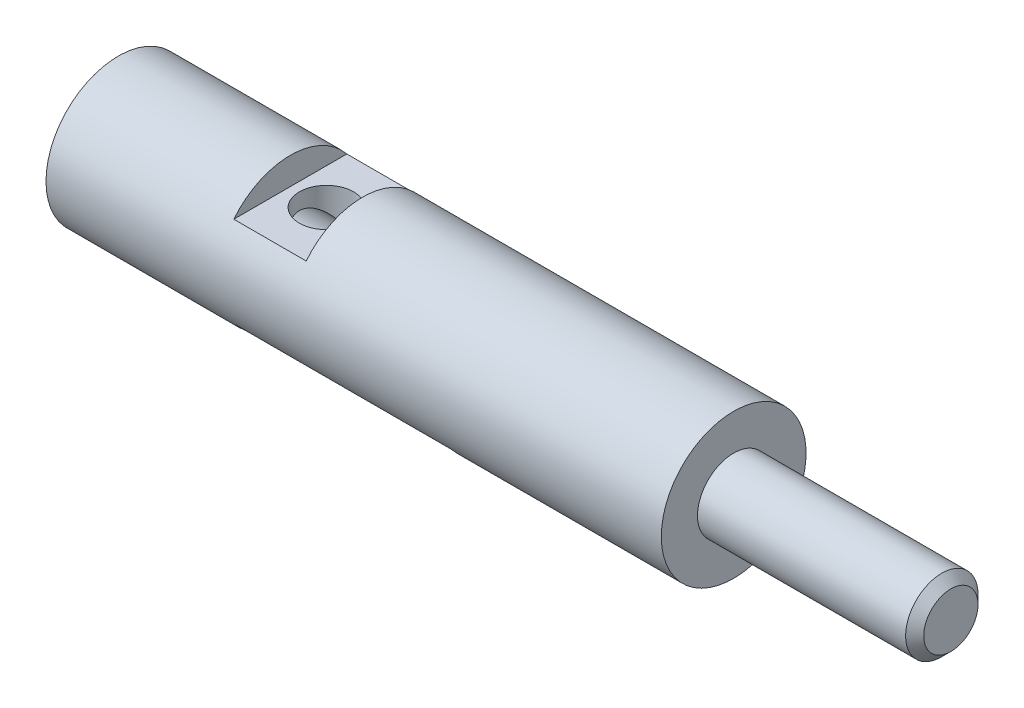
ISO-10303-21;
HEADER;
FILE_DESCRIPTION(('STEP AP214'),'2;1');
FILE_NAME('part.step','',(''),(''),'','','');
FILE_SCHEMA(('AUTOMOTIVE_DESIGN { 1 0 10303 214 1 1 1 1 }'));
ENDSEC;
DATA;
#1=APPLICATION_CONTEXT('core data for automotive mechanical design processes');
#2=APPLICATION_PROTOCOL_DEFINITION('international standard','automotive_design',2000,#1);
#3=PRODUCT_CONTEXT('',#1,'mechanical');
#4=PRODUCT('Part','Part','',(#3));
#5=PRODUCT_RELATED_PRODUCT_CATEGORY('part','',(#4));
#6=PRODUCT_DEFINITION_FORMATION('','',#4);
#7=PRODUCT_DEFINITION_CONTEXT('part definition',#1,'design');
#8=PRODUCT_DEFINITION('design','',#6,#7);
#9=PRODUCT_DEFINITION_SHAPE('','',#8);
#10=(LENGTH_UNIT() NAMED_UNIT(*) SI_UNIT(.MILLI.,.METRE.));
#11=(NAMED_UNIT(*) PLANE_ANGLE_UNIT() SI_UNIT($,.RADIAN.));
#12=(NAMED_UNIT(*) SI_UNIT($,.STERADIAN.) SOLID_ANGLE_UNIT());
#13=UNCERTAINTY_MEASURE_WITH_UNIT(LENGTH_MEASURE(1.E-05),#10,'distance_accuracy_value','');
#14=(GEOMETRIC_REPRESENTATION_CONTEXT(3) GLOBAL_UNCERTAINTY_ASSIGNED_CONTEXT((#13)) GLOBAL_UNIT_ASSIGNED_CONTEXT((#10,
#11,#12)) REPRESENTATION_CONTEXT('',''));
#15=CARTESIAN_POINT('',(0.,0.,0.));
#16=DIRECTION('',(0.,0.,1.));
#17=DIRECTION('',(1.,0.,0.));
#18=AXIS2_PLACEMENT_3D('',#15,#16,#17);
#19=CARTESIAN_POINT('',(-15.6774193548387,0.,0.));
#20=DIRECTION('',(-1.,0.,0.));
#21=DIRECTION('',(0.,0.,1.));
#22=AXIS2_PLACEMENT_3D('',#19,#20,#21);
#23=PLANE('',#22);
#24=CARTESIAN_POINT('',(-15.6774193548387,0.,0.));
#25=DIRECTION('',(-1.,0.,0.));
#26=DIRECTION('',(0.,0.,1.));
#27=AXIS2_PLACEMENT_3D('',#24,#25,#26);
#28=CIRCLE('',#27,1.59999999999999);
#29=CARTESIAN_POINT('',(-15.6774193548387,0.,1.59999999999999));
#30=VERTEX_POINT('',#29);
#31=EDGE_CURVE('E115',#30,#30,#28,.T.);
#32=ORIENTED_EDGE('',*,*,#31,.F.);
#33=EDGE_LOOP('',(#32));
#34=FACE_BOUND('',#33,.T.);
#35=CARTESIAN_POINT('',(-15.6774193548387,0.,0.));
#36=DIRECTION('',(-1.,0.,0.));
#37=DIRECTION('',(0.,0.,1.));
#38=AXIS2_PLACEMENT_3D('',#35,#36,#37);
#39=CIRCLE('',#38,4.);
#40=CARTESIAN_POINT('',(-15.6774193548387,0.,4.));
#41=VERTEX_POINT('',#40);
#42=EDGE_CURVE('E131',#41,#41,#39,.T.);
#43=ORIENTED_EDGE('',*,*,#42,.T.);
#44=EDGE_LOOP('',(#43));
#45=FACE_BOUND('',#44,.T.);
#46=ADVANCED_FACE('F40',(#34,#45),#23,.T.);
#47=CARTESIAN_POINT('',(-21.4193548387097,0.,0.));
#48=DIRECTION('',(-1.,0.,0.));
#49=DIRECTION('',(0.,0.,1.));
#50=AXIS2_PLACEMENT_3D('',#47,#48,#49);
#51=CYLINDRICAL_SURFACE('',#50,4.);
#52=CARTESIAN_POINT('',(5.8225806451613,0.,0.));
#53=DIRECTION('',(1.,0.,0.));
#54=DIRECTION('',(0.,0.,-1.));
#55=AXIS2_PLACEMENT_3D('',#52,#53,#54);
#56=CIRCLE('',#55,4.);
#57=CARTESIAN_POINT('',(5.8225806451613,-2.5,-3.1224989991992));
#58=VERTEX_POINT('',#57);
#59=CARTESIAN_POINT('',(5.8225806451613,-2.5,3.1224989991992));
#60=VERTEX_POINT('',#59);
#61=EDGE_CURVE('E99',#58,#60,#56,.F.);
#62=ORIENTED_EDGE('',*,*,#61,.F.);
#63=DIRECTION('',(-1.,0.,0.));
#64=VECTOR('',#63,1.);
#65=CARTESIAN_POINT('',(-21.4193548387097,-2.5,-3.1224989991992));
#66=LINE('',#65,#64);
#67=CARTESIAN_POINT('',(-6.1774193548387,-2.5,-3.1224989991992));
#68=VERTEX_POINT('',#67);
#69=EDGE_CURVE('E11',#68,#58,#66,.F.);
#70=ORIENTED_EDGE('',*,*,#69,.F.);
#71=CARTESIAN_POINT('',(-6.1774193548387,0.,0.));
#72=DIRECTION('',(-1.,0.,0.));
#73=DIRECTION('',(0.,0.,1.));
#74=AXIS2_PLACEMENT_3D('',#71,#72,#73);
#75=CIRCLE('',#74,4.);
#76=CARTESIAN_POINT('',(-6.1774193548387,-2.5,3.1224989991992));
#77=VERTEX_POINT('',#76);
#78=EDGE_CURVE('E50',#77,#68,#75,.F.);
#79=ORIENTED_EDGE('',*,*,#78,.F.);
#80=DIRECTION('',(-1.,0.,0.));
#81=VECTOR('',#80,1.);
#82=CARTESIAN_POINT('',(-21.4193548387097,-2.5,3.1224989991992));
#83=LINE('',#82,#81);
#84=EDGE_CURVE('E149',#60,#77,#83,.T.);
#85=ORIENTED_EDGE('',*,*,#84,.F.);
#86=EDGE_LOOP('',(#62,#70,#79,#85));
#87=FACE_BOUND('',#86,.T.);
#88=CARTESIAN_POINT('',(-2.1774193548387,0.,0.));
#89=DIRECTION('',(1.,0.,0.));
#90=DIRECTION('',(0.,1.,0.));
#91=AXIS2_PLACEMENT_3D('',#88,#89,#90);
#92=CIRCLE('',#91,4.);
#93=CARTESIAN_POINT('',(-2.1774193548387,2.5,3.1224989991992));
#94=VERTEX_POINT('',#93);
#95=CARTESIAN_POINT('',(-2.1774193548387,2.5,-3.1224989991992));
#96=VERTEX_POINT('',#95);
#97=EDGE_CURVE('E85',#94,#96,#92,.F.);
#98=ORIENTED_EDGE('',*,*,#97,.F.);
#99=DIRECTION('',(-1.,0.,0.));
#100=VECTOR('',#99,1.);
#101=CARTESIAN_POINT('',(-21.4193548387097,2.5,3.1224989991992));
#102=LINE('',#101,#100);
#103=CARTESIAN_POINT('',(-6.1774193548387,2.5,3.1224989991992));
#104=VERTEX_POINT('',#103);
#105=EDGE_CURVE('E88',#104,#94,#102,.F.);
#106=ORIENTED_EDGE('',*,*,#105,.F.);
#107=CARTESIAN_POINT('',(-6.17741935483869,0.,0.));
#108=DIRECTION('',(-1.,0.,0.));
#109=DIRECTION('',(0.,-1.,0.));
#110=AXIS2_PLACEMENT_3D('',#107,#108,#109);
#111=CIRCLE('',#110,4.);
#112=CARTESIAN_POINT('',(-6.1774193548387,2.5,-3.1224989991992));
#113=VERTEX_POINT('',#112);
#114=EDGE_CURVE('E92',#113,#104,#111,.F.);
#115=ORIENTED_EDGE('',*,*,#114,.F.);
#116=DIRECTION('',(-1.,0.,0.));
#117=VECTOR('',#116,1.);
#118=CARTESIAN_POINT('',(-21.4193548387097,2.5,-3.1224989991992));
#119=LINE('',#118,#117);
#120=EDGE_CURVE('E89',#96,#113,#119,.T.);
#121=ORIENTED_EDGE('',*,*,#120,.F.);
#122=EDGE_LOOP('',(#98,#106,#115,#121));
#123=FACE_BOUND('',#122,.T.);
#124=CARTESIAN_POINT('',(18.3225806451613,0.,0.));
#125=DIRECTION('',(-1.,0.,0.));
#126=DIRECTION('',(0.,0.,1.));
#127=AXIS2_PLACEMENT_3D('',#124,#125,#126);
#128=CIRCLE('',#127,4.);
#129=CARTESIAN_POINT('',(18.3225806451613,0.,4.));
#130=VERTEX_POINT('',#129);
#131=EDGE_CURVE('E127',#130,#130,#128,.T.);
#132=ORIENTED_EDGE('',*,*,#131,.T.);
#133=EDGE_LOOP('',(#132));
#134=FACE_BOUND('',#133,.T.);
#135=ORIENTED_EDGE('',*,*,#42,.F.);
#136=EDGE_LOOP('',(#135));
#137=FACE_BOUND('',#136,.T.);
#138=ADVANCED_FACE('F86',(#87,#123,#134,#137),#51,.T.);
#139=CARTESIAN_POINT('',(18.3225806451613,-4.,0.));
#140=DIRECTION('',(1.,0.,0.));
#141=DIRECTION('',(0.,0.,-1.));
#142=AXIS2_PLACEMENT_3D('',#139,#140,#141);
#143=PLANE('',#142);
#144=CARTESIAN_POINT('',(18.3225806451613,0.,0.));
#145=DIRECTION('',(-1.,0.,0.));
#146=DIRECTION('',(0.,0.,1.));
#147=AXIS2_PLACEMENT_3D('',#144,#145,#146);
#148=CIRCLE('',#147,2.);
#149=CARTESIAN_POINT('',(18.3225806451613,0.,2.));
#150=VERTEX_POINT('',#149);
#151=EDGE_CURVE('E123',#150,#150,#148,.T.);
#152=ORIENTED_EDGE('',*,*,#151,.T.);
#153=EDGE_LOOP('',(#152));
#154=FACE_BOUND('',#153,.T.);
#155=ORIENTED_EDGE('',*,*,#131,.F.);
#156=EDGE_LOOP('',(#155));
#157=FACE_BOUND('',#156,.T.);
#158=ADVANCED_FACE('F183',(#154,#157),#143,.T.);
#159=CARTESIAN_POINT('',(-21.4193548387097,0.,0.));
#160=DIRECTION('',(-1.,0.,0.));
#161=DIRECTION('',(0.,0.,1.));
#162=AXIS2_PLACEMENT_3D('',#159,#160,#161);
#163=CYLINDRICAL_SURFACE('',#162,2.);
#164=CARTESIAN_POINT('',(29.8225806451613,0.,0.));
#165=DIRECTION('',(1.,0.,0.));
#166=DIRECTION('',(0.,0.,-1.));
#167=AXIS2_PLACEMENT_3D('',#164,#165,#166);
#168=CIRCLE('',#167,2.);
#169=CARTESIAN_POINT('',(29.8225806451613,0.,-2.));
#170=VERTEX_POINT('',#169);
#171=EDGE_CURVE('E135',#170,#170,#168,.F.);
#172=ORIENTED_EDGE('',*,*,#171,.T.);
#173=EDGE_LOOP('',(#172));
#174=FACE_BOUND('',#173,.T.);
#175=ORIENTED_EDGE('',*,*,#151,.F.);
#176=EDGE_LOOP('',(#175));
#177=FACE_BOUND('',#176,.T.);
#178=ADVANCED_FACE('F190',(#174,#177),#163,.T.);
#179=CARTESIAN_POINT('',(30.3225806451613,-2.,0.));
#180=DIRECTION('',(1.,0.,0.));
#181=DIRECTION('',(0.,0.,-1.));
#182=AXIS2_PLACEMENT_3D('',#179,#180,#181);
#183=PLANE('',#182);
#184=CARTESIAN_POINT('',(30.3225806451613,0.,0.));
#185=DIRECTION('',(1.,0.,0.));
#186=DIRECTION('',(0.,0.,-1.));
#187=AXIS2_PLACEMENT_3D('',#184,#185,#186);
#188=CIRCLE('',#187,1.5);
#189=CARTESIAN_POINT('',(30.3225806451613,0.,-1.5));
#190=VERTEX_POINT('',#189);
#191=EDGE_CURVE('E139',#190,#190,#188,.T.);
#192=ORIENTED_EDGE('',*,*,#191,.T.);
#193=EDGE_LOOP('',(#192));
#194=FACE_BOUND('',#193,.T.);
#195=ADVANCED_FACE('F194',(#194),#183,.T.);
#196=CARTESIAN_POINT('',(29.8225806451613,0.,0.));
#197=DIRECTION('',(-1.,0.,0.));
#198=DIRECTION('',(0.,0.,1.));
#199=AXIS2_PLACEMENT_3D('',#196,#197,#198);
#200=CONICAL_SURFACE('',#199,2.,0.78539816339744);
#201=ORIENTED_EDGE('',*,*,#191,.F.);
#202=EDGE_LOOP('',(#201));
#203=FACE_BOUND('',#202,.T.);
#204=ORIENTED_EDGE('',*,*,#171,.F.);
#205=EDGE_LOOP('',(#204));
#206=FACE_BOUND('',#205,.T.);
#207=ADVANCED_FACE('F43',(#203,#206),#200,.T.);
#208=CARTESIAN_POINT('',(-1.6774193548387,0.,0.));
#209=DIRECTION('',(-1.,0.,0.));
#210=DIRECTION('',(0.,0.,1.));
#211=AXIS2_PLACEMENT_3D('',#208,#209,#210);
#212=CONICAL_SURFACE('',#211,1.6,1.02974425867665);
#213=CARTESIAN_POINT('',(-0.7160423643946,0.,0.));
#214=VERTEX_POINT('',#213);
#215=VERTEX_LOOP('',#214);
#216=FACE_BOUND('',#215,.T.);
#217=CARTESIAN_POINT('',(-1.6774193548387,0.,0.));
#218=DIRECTION('',(-1.,0.,0.));
#219=DIRECTION('',(0.,0.,1.));
#220=AXIS2_PLACEMENT_3D('',#217,#218,#219);
#221=CIRCLE('',#220,1.6);
#222=CARTESIAN_POINT('',(-1.6774193548387,0.,1.6));
#223=VERTEX_POINT('',#222);
#224=EDGE_CURVE('E119',#223,#223,#221,.T.);
#225=ORIENTED_EDGE('',*,*,#224,.T.);
#226=EDGE_LOOP('',(#225));
#227=FACE_BOUND('',#226,.T.);
#228=ADVANCED_FACE('F199',(#216,#227),#212,.F.);
#229=CARTESIAN_POINT('',(-15.6774193548387,0.,0.));
#230=DIRECTION('',(-1.,0.,0.));
#231=DIRECTION('',(0.,0.,1.));
#232=AXIS2_PLACEMENT_3D('',#229,#230,#231);
#233=CYLINDRICAL_SURFACE('',#232,1.59999999999999);
#234=CARTESIAN_POINT('',(-4.1774193548387,0.556776436282982,1.5));
#235=CARTESIAN_POINT('',(-4.13823363624218,0.556794360307957,1.49999591748038));
#236=CARTESIAN_POINT('',(-4.09898417362593,0.561044818005696,1.49843522559346));
#237=CARTESIAN_POINT('',(-4.02213426123864,0.576770998609167,1.49244676287404));
#238=CARTESIAN_POINT('',(-3.98454425011322,0.588286957962538,1.48800302176562));
#239=CARTESIAN_POINT('',(-3.89141145581981,0.623719616327495,1.47360085341389));
#240=CARTESIAN_POINT('',(-3.8374669379379,0.65097178401395,1.46195096807718));
#241=CARTESIAN_POINT('',(-3.73382850897223,0.710622919731765,1.43391850703446));
#242=CARTESIAN_POINT('',(-3.68415281490706,0.74304240844939,1.4175168390555));
#243=CARTESIAN_POINT('',(-3.58859824607405,0.809669158095594,1.38053371899763));
#244=CARTESIAN_POINT('',(-3.54268165158658,0.843850970278846,1.36000358385786));
#245=CARTESIAN_POINT('',(-3.45348473622686,0.912847778038623,1.31469444042559));
#246=CARTESIAN_POINT('',(-3.41020653251755,0.947663253747795,1.28991207923037));
#247=CARTESIAN_POINT('',(-3.28417818317098,1.05146267100392,1.20916432834585));
#248=CARTESIAN_POINT('',(-3.20499154202155,1.11998237999353,1.146703710984));
#249=CARTESIAN_POINT('',(-3.07756217907269,1.23251534447499,1.0227192324906));
#250=CARTESIAN_POINT('',(-3.02669545492086,1.27819470502894,0.965377618728459));
#251=CARTESIAN_POINT('',(-2.93268703822664,1.36343557192659,0.840664900623478));
#252=CARTESIAN_POINT('',(-2.88953201919341,1.40300761577932,0.77331147397631));
#253=CARTESIAN_POINT('',(-2.82113967641256,1.46607021232606,0.64396348077451));
#254=CARTESIAN_POINT('',(-2.7940425246034,1.49119386471929,0.583755998073617));
#255=CARTESIAN_POINT('',(-2.74750260562651,1.53446652026933,0.458059363442058));
#256=CARTESIAN_POINT('',(-2.72805538485345,1.552619581389,0.392573311405427));
#257=CARTESIAN_POINT('',(-2.69802404126202,1.5806903204111,0.257326083662318));
#258=CARTESIAN_POINT('',(-2.68750527696568,1.59054726432285,0.187537326745425));
#259=CARTESIAN_POINT('',(-2.676475633874,1.60088350783195,0.0464918125339137));
#260=CARTESIAN_POINT('',(-2.67595911066608,1.60136809638785,-0.0247640940966152));
#261=CARTESIAN_POINT('',(-2.68442480693368,1.59343382568127,-0.157736549752924));
#262=CARTESIAN_POINT('',(-2.69230088854032,1.58605177562569,-0.219592366952549));
#263=CARTESIAN_POINT('',(-2.71532281224294,1.56451584128409,-0.340696569030925));
#264=CARTESIAN_POINT('',(-2.7304696098633,1.55036106692101,-0.399944610075669));
#265=CARTESIAN_POINT('',(-2.76773969318756,1.51563493876984,-0.5163916898537));
#266=CARTESIAN_POINT('',(-2.79006661674576,1.49487650971999,-0.573468442197482));
#267=CARTESIAN_POINT('',(-2.84045555208214,1.4482341941657,-0.682755818026335));
#268=CARTESIAN_POINT('',(-2.86852052135785,1.4223476647559,-0.734963911825111));
#269=CARTESIAN_POINT('',(-2.94526334721167,1.35198379933556,-0.86001533848314));
#270=CARTESIAN_POINT('',(-2.9970661024411,1.30484385304295,-0.929452181151883));
#271=CARTESIAN_POINT('',(-3.10900793128258,1.20452709782384,-1.05626118683587));
#272=CARTESIAN_POINT('',(-3.16916828413499,1.15133494402957,-1.11360158160239));
#273=CARTESIAN_POINT('',(-3.29782440050931,1.0404588252606,-1.21793057162936));
#274=CARTESIAN_POINT('',(-3.36649172144518,0.98269554515426,-1.26462261332803));
#275=CARTESIAN_POINT('',(-3.47457609184471,0.896400246708986,-1.32578864668944));
#276=CARTESIAN_POINT('',(-3.51143590509328,0.867704668630932,-1.34469294267239));
#277=CARTESIAN_POINT('',(-3.58707680767766,0.81109103603349,-1.3795766818766));
#278=CARTESIAN_POINT('',(-3.62585681431179,0.783172556912582,-1.39555775002595));
#279=CARTESIAN_POINT('',(-3.70438567905038,0.730034833348397,-1.42405294767729));
#280=CARTESIAN_POINT('',(-3.74405834777837,0.704756446938291,-1.43666542712607));
#281=CARTESIAN_POINT('',(-3.82616035279892,0.657458134852921,-1.45891248428436));
#282=CARTESIAN_POINT('',(-3.86858784553298,0.635436061710255,-1.46854902916381));
#283=CARTESIAN_POINT('',(-3.94433916624244,0.602923921462708,-1.48212800618862));
#284=CARTESIAN_POINT('',(-3.9768469855848,0.590933673151373,-1.48690999896823));
#285=CARTESIAN_POINT('',(-4.04344499092091,0.571787904059256,-1.4943780658291));
#286=CARTESIAN_POINT('',(-4.07752914992899,0.564615371353656,-1.49707152004778));
#287=CARTESIAN_POINT('',(-4.14702133679534,0.556533644450696,-1.5000979785989));
#288=CARTESIAN_POINT('',(-4.18244048776492,0.555702522961238,-1.50040156130741));
#289=CARTESIAN_POINT('',(-4.25274745982296,0.560745403059106,-1.49852224877674));
#290=CARTESIAN_POINT('',(-4.28763428432232,0.56663071271835,-1.49633516014947));
#291=CARTESIAN_POINT('',(-4.36488363867376,0.585987747436421,-1.48887399471504));
#292=CARTESIAN_POINT('',(-4.40675466051854,0.601065676571939,-1.48293152579866));
#293=CARTESIAN_POINT('',(-4.48776818105156,0.63637476993074,-1.46812610485829));
#294=CARTESIAN_POINT('',(-4.5268973657182,0.656629121488784,-1.45924995779248));
#295=CARTESIAN_POINT('',(-4.60610774147737,0.701875957011564,-1.43807094680483));
#296=CARTESIAN_POINT('',(-4.64597513494997,0.727127447111385,-1.42553699648588));
#297=CARTESIAN_POINT('',(-4.72354004270174,0.779381216672911,-1.39765829599652));
#298=CARTESIAN_POINT('',(-4.76123521609739,0.806385320599613,-1.38231058538123));
#299=CARTESIAN_POINT('',(-4.87169098344386,0.888565802626724,-1.33212338501919));
#300=CARTESIAN_POINT('',(-4.9417688490482,0.944876404979499,-1.29315455355405));
#301=CARTESIAN_POINT('',(-5.08442961609809,1.06346466202037,-1.1981633516916));
#302=CARTESIAN_POINT('',(-5.15612867442561,1.12555244106209,-1.14057168012526));
#303=CARTESIAN_POINT('',(-5.29004226101995,1.24376611252864,-1.0103187719926));
#304=CARTESIAN_POINT('',(-5.35228249766613,1.29990803456026,-0.937699696936961));
#305=CARTESIAN_POINT('',(-5.44656536366738,1.38581738600687,-0.802349359308891));
#306=CARTESIAN_POINT('',(-5.48194912701969,1.41832676541825,-0.743690415358204));
#307=CARTESIAN_POINT('',(-5.54531616570097,1.47681810938688,-0.619444268612386));
#308=CARTESIAN_POINT('',(-5.57330283655778,1.50280306860941,-0.553860264082423));
#309=CARTESIAN_POINT('',(-5.62039386239728,1.54664191116037,-0.416132357086028));
#310=CARTESIAN_POINT('',(-5.63940687784587,1.56441214386839,-0.343929571020733));
#311=CARTESIAN_POINT('',(-5.6664850233918,1.58974621337111,-0.195778793134314));
#312=CARTESIAN_POINT('',(-5.67456386305744,1.59732283112781,-0.119835615238127));
#313=CARTESIAN_POINT('',(-5.67867938312097,1.60118142855586,0.0213844278401919));
#314=CARTESIAN_POINT('',(-5.67631755384493,1.59896550128956,0.0865810741849092));
#315=CARTESIAN_POINT('',(-5.66328521726601,1.58675521818545,0.21538497970823));
#316=CARTESIAN_POINT('',(-5.65261454462678,1.57676070756285,0.278992207233245));
#317=CARTESIAN_POINT('',(-5.62425113774713,1.55025729530819,0.40053962513911));
#318=CARTESIAN_POINT('',(-5.60683584783482,1.53400591293725,0.45860277907101));
#319=CARTESIAN_POINT('',(-5.56593756173461,1.49597032013068,0.570593038239533));
#320=CARTESIAN_POINT('',(-5.54245288513228,1.47418457744041,0.624518992650218));
#321=CARTESIAN_POINT('',(-5.47890858078824,1.41550764514738,0.750363070660043));
#322=CARTESIAN_POINT('',(-5.43610141306924,1.37618659115259,0.819766297816088));
#323=CARTESIAN_POINT('',(-5.34232565864489,1.29098055656235,0.948345574819154));
#324=CARTESIAN_POINT('',(-5.29133452929891,1.24507748420789,1.0074924092351));
#325=CARTESIAN_POINT('',(-5.16519978485016,1.13337313253743,1.13342217165849));
#326=CARTESIAN_POINT('',(-5.08761456614335,1.06597772201332,1.19636468348736));
#327=CARTESIAN_POINT('',(-4.96423818272872,0.963626132389684,1.27802222267965));
#328=CARTESIAN_POINT('',(-4.92193777284556,0.929292684294567,1.30311884655893));
#329=CARTESIAN_POINT('',(-4.8348164019087,0.861061187823723,1.34916941560521));
#330=CARTESIAN_POINT('',(-4.78999729546067,0.827162841087291,1.37012635892995));
#331=CARTESIAN_POINT('',(-4.70308202675781,0.765186331725733,1.40556193303023));
#332=CARTESIAN_POINT('',(-4.66132644384859,0.736904357786049,1.42051992697613));
#333=CARTESIAN_POINT('',(-4.5749165760533,0.683262384342947,1.4470794941691));
#334=CARTESIAN_POINT('',(-4.53026489978664,0.65789981083788,1.45868403796628));
#335=CARTESIAN_POINT('',(-4.45066088285969,0.61953620393305,1.47529002940827));
#336=CARTESIAN_POINT('',(-4.41662401766548,0.605079465217446,1.48123061340837));
#337=CARTESIAN_POINT('',(-4.34659455362335,0.580995573994624,1.49084374250073));
#338=CARTESIAN_POINT('',(-4.31061001375884,0.571349988908746,1.49452495643113));
#339=CARTESIAN_POINT('',(-4.25805403572211,0.562364796796324,1.49791653162561));
#340=CARTESIAN_POINT('',(-4.24200716209504,0.560281586776114,1.49869523729355));
#341=CARTESIAN_POINT('',(-4.20978357625491,0.557483909896239,1.49973773738807));
#342=CARTESIAN_POINT('',(-4.1936069045091,0.556769031900595,1.50000168648149));
#343=CARTESIAN_POINT('',(-4.1774193548387,0.556776436282982,1.5));
#344=B_SPLINE_CURVE_WITH_KNOTS('',3,(#234,#235,#236,#237,#238,#239,#240,#241,#242,#243,#244,
#245,#246,#247,#248,#249,#250,#251,#252,#253,#254,#255,#256,#257,#258,#259,#260,#261,#262,#263,
#264,#265,#266,#267,#268,#269,#270,#271,#272,#273,#274,#275,#276,#277,#278,#279,#280,#281,#282,
#283,#284,#285,#286,#287,#288,#289,#290,#291,#292,#293,#294,#295,#296,#297,#298,#299,#300,#301,
#302,#303,#304,#305,#306,#307,#308,#309,#310,#311,#312,#313,#314,#315,#316,#317,#318,#319,#320,
#321,#322,#323,#324,#325,#326,#327,#328,#329,#330,#331,#332,#333,#334,#335,#336,#337,#338,#339,
#340,#341,#342,#343),.UNSPECIFIED.,.T.,.F.,(4,2,2,2,2,2,2,2,2,2,2,2,2,2,2,2,2,2,2,2,2,2,2,2,2,2,
2,2,2,2,2,2,2,2,2,2,2,2,2,2,2,2,2,2,2,2,2,2,2,2,2,2,2,2,4),(0.,0.117467589907523,
0.235591496886632,0.419191548610675,0.603539771072577,0.785724324058831,0.968053196290101,
1.33176639501296,1.59859725966632,1.8649624619968,2.07606795276693,2.28705036047584,
2.49956421012259,2.71195813156401,2.89945993597832,3.08698638880656,3.28038593318391,
3.47388541178764,3.7681180246498,4.06311400101066,4.36552771567755,4.51661541633713,
4.66761887528795,4.81355475017567,4.95939395014827,5.0640157805713,5.16826620902108,
5.27379808421622,5.37950789986953,5.51344673278504,5.64799638304859,5.79426226369867,
5.94068292772845,6.23371637533388,6.5653104160989,6.89598643869102,7.12267164549568,
7.34925261431564,7.57809261806565,7.80664542932905,8.001462158697,8.19628276479111,
8.38381973308355,8.57140867995027,8.84148188939826,9.11231219966085,9.47181652635999,
9.65163562334721,9.8313240052241,9.98896636078536,10.1464686426564,10.2585582522236,
10.3702150586827,10.418755295126,10.4672809446329),.UNSPECIFIED.);
#345=CARTESIAN_POINT('',(-4.1774193548387,0.556776436282982,1.5));
#346=VERTEX_POINT('',#345);
#347=EDGE_CURVE('E111',#346,#346,#344,.T.);
#348=ORIENTED_EDGE('',*,*,#347,.T.);
#349=EDGE_LOOP('',(#348));
#350=FACE_BOUND('',#349,.T.);
#351=ORIENTED_EDGE('',*,*,#224,.F.);
#352=EDGE_LOOP('',(#351));
#353=FACE_BOUND('',#352,.T.);
#354=ORIENTED_EDGE('',*,*,#31,.T.);
#355=EDGE_LOOP('',(#354));
#356=FACE_BOUND('',#355,.T.);
#357=ADVANCED_FACE('F202',(#350,#353,#356),#233,.F.);
#358=CARTESIAN_POINT('',(-6.1774193548387,4.,-4.));
#359=DIRECTION('',(-1.,0.,0.));
#360=DIRECTION('',(0.,-1.,0.));
#361=AXIS2_PLACEMENT_3D('',#358,#359,#360);
#362=PLANE('',#361);
#363=DIRECTION('',(0.,0.,1.));
#364=VECTOR('',#363,1.);
#365=CARTESIAN_POINT('',(-6.1774193548387,2.5,-4.));
#366=LINE('',#365,#364);
#367=EDGE_CURVE('E97',#113,#104,#366,.T.);
#368=ORIENTED_EDGE('',*,*,#367,.F.);
#369=ORIENTED_EDGE('',*,*,#114,.T.);
#370=EDGE_LOOP('',(#368,#369));
#371=FACE_BOUND('',#370,.T.);
#372=ADVANCED_FACE('F205',(#371),#362,.F.);
#373=CARTESIAN_POINT('',(-2.1774193548387,4.,-4.));
#374=DIRECTION('',(1.,0.,0.));
#375=DIRECTION('',(0.,1.,0.));
#376=AXIS2_PLACEMENT_3D('',#373,#374,#375);
#377=PLANE('',#376);
#378=ORIENTED_EDGE('',*,*,#97,.T.);
#379=DIRECTION('',(0.,0.,1.));
#380=VECTOR('',#379,1.);
#381=CARTESIAN_POINT('',(-2.1774193548387,2.5,-4.));
#382=LINE('',#381,#380);
#383=EDGE_CURVE('E57',#96,#94,#382,.T.);
#384=ORIENTED_EDGE('',*,*,#383,.T.);
#385=EDGE_LOOP('',(#378,#384));
#386=FACE_BOUND('',#385,.T.);
#387=ADVANCED_FACE('F101',(#386),#377,.F.);
#388=CARTESIAN_POINT('',(-6.1774193548387,2.5,-4.));
#389=DIRECTION('',(0.,-1.,0.));
#390=DIRECTION('',(0.,0.,-1.));
#391=AXIS2_PLACEMENT_3D('',#388,#389,#390);
#392=PLANE('',#391);
#393=CARTESIAN_POINT('',(-4.1774193548387,2.5,0.));
#394=DIRECTION('',(0.,1.,0.));
#395=DIRECTION('',(0.,0.,1.));
#396=AXIS2_PLACEMENT_3D('',#393,#394,#395);
#397=CIRCLE('',#396,1.5);
#398=CARTESIAN_POINT('',(-4.1774193548387,2.5,1.5));
#399=VERTEX_POINT('',#398);
#400=EDGE_CURVE('E344',#399,#399,#397,.T.);
#401=ORIENTED_EDGE('',*,*,#400,.F.);
#402=EDGE_LOOP('',(#401));
#403=FACE_BOUND('',#402,.T.);
#404=ORIENTED_EDGE('',*,*,#105,.T.);
#405=ORIENTED_EDGE('',*,*,#383,.F.);
#406=ORIENTED_EDGE('',*,*,#120,.T.);
#407=ORIENTED_EDGE('',*,*,#367,.T.);
#408=EDGE_LOOP('',(#404,#405,#406,#407));
#409=FACE_BOUND('',#408,.T.);
#410=ADVANCED_FACE('F95',(#403,#409),#392,.F.);
#411=CARTESIAN_POINT('',(-6.1774193548387,-4.,-4.));
#412=DIRECTION('',(-1.,0.,0.));
#413=DIRECTION('',(0.,0.,1.));
#414=AXIS2_PLACEMENT_3D('',#411,#412,#413);
#415=PLANE('',#414);
#416=DIRECTION('',(0.,0.,1.));
#417=VECTOR('',#416,1.);
#418=CARTESIAN_POINT('',(-6.1774193548387,-2.5,-4.));
#419=LINE('',#418,#417);
#420=EDGE_CURVE('E109',#68,#77,#419,.T.);
#421=ORIENTED_EDGE('',*,*,#420,.T.);
#422=ORIENTED_EDGE('',*,*,#78,.T.);
#423=EDGE_LOOP('',(#421,#422));
#424=FACE_BOUND('',#423,.T.);
#425=ADVANCED_FACE('F157',(#424),#415,.F.);
#426=CARTESIAN_POINT('',(-6.1774193548387,-2.5,-4.));
#427=DIRECTION('',(0.,1.,0.));
#428=DIRECTION('',(0.,0.,1.));
#429=AXIS2_PLACEMENT_3D('',#426,#427,#428);
#430=PLANE('',#429);
#431=ORIENTED_EDGE('',*,*,#69,.T.);
#432=DIRECTION('',(0.,0.,1.));
#433=VECTOR('',#432,1.);
#434=CARTESIAN_POINT('',(5.8225806451613,-2.5,-4.));
#435=LINE('',#434,#433);
#436=EDGE_CURVE('E103',#58,#60,#435,.T.);
#437=ORIENTED_EDGE('',*,*,#436,.T.);
#438=ORIENTED_EDGE('',*,*,#84,.T.);
#439=ORIENTED_EDGE('',*,*,#420,.F.);
#440=EDGE_LOOP('',(#431,#437,#438,#439));
#441=FACE_BOUND('',#440,.T.);
#442=ADVANCED_FACE('F162',(#441),#430,.F.);
#443=CARTESIAN_POINT('',(5.8225806451613,-4.,-4.));
#444=DIRECTION('',(1.,0.,0.));
#445=DIRECTION('',(0.,0.,-1.));
#446=AXIS2_PLACEMENT_3D('',#443,#444,#445);
#447=PLANE('',#446);
#448=ORIENTED_EDGE('',*,*,#436,.F.);
#449=ORIENTED_EDGE('',*,*,#61,.T.);
#450=EDGE_LOOP('',(#448,#449));
#451=FACE_BOUND('',#450,.T.);
#452=ADVANCED_FACE('F166',(#451),#447,.F.);
#453=CARTESIAN_POINT('',(-4.1774193548387,2.5,0.));
#454=DIRECTION('',(0.,1.,0.));
#455=DIRECTION('',(0.,0.,1.));
#456=AXIS2_PLACEMENT_3D('',#453,#454,#455);
#457=CYLINDRICAL_SURFACE('',#456,1.5);
#458=ORIENTED_EDGE('',*,*,#347,.F.);
#459=EDGE_LOOP('',(#458));
#460=FACE_BOUND('',#459,.T.);
#461=ORIENTED_EDGE('',*,*,#400,.T.);
#462=EDGE_LOOP('',(#461));
#463=FACE_BOUND('',#462,.T.);
#464=ADVANCED_FACE('F168',(#460,#463),#457,.F.);
#465=CLOSED_SHELL('',(#46,#138,#158,#178,#195,#207,#228,#357,#372,#387,#410,#425,#442,#452,#464));
#466=MANIFOLD_SOLID_BREP('B2',#465);
#467=ADVANCED_BREP_SHAPE_REPRESENTATION('',(#18,#466),#14);
#468=SHAPE_DEFINITION_REPRESENTATION(#9,#467);
ENDSEC;
END-ISO-10303-21;
